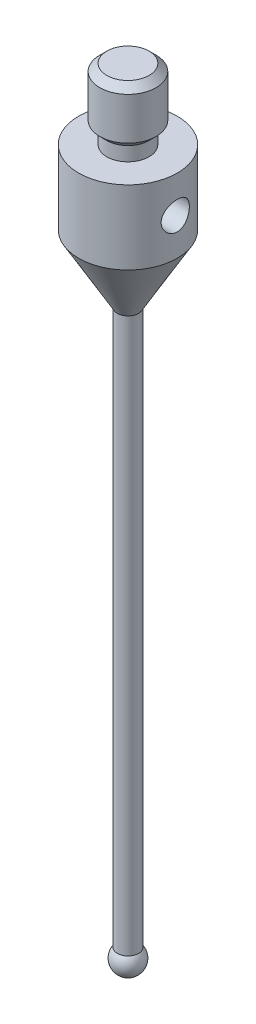
ISO-10303-21;
HEADER;
FILE_DESCRIPTION(('STEP AP214'),'2;1');
FILE_NAME('part.step','',(''),(''),'','','');
FILE_SCHEMA(('AUTOMOTIVE_DESIGN { 1 0 10303 214 1 1 1 1 }'));
ENDSEC;
DATA;
#1=APPLICATION_CONTEXT('core data for automotive mechanical design processes');
#2=APPLICATION_PROTOCOL_DEFINITION('international standard','automotive_design',2000,#1);
#3=PRODUCT_CONTEXT('',#1,'mechanical');
#4=PRODUCT('Part','Part','',(#3));
#5=PRODUCT_RELATED_PRODUCT_CATEGORY('part','',(#4));
#6=PRODUCT_DEFINITION_FORMATION('','',#4);
#7=PRODUCT_DEFINITION_CONTEXT('part definition',#1,'design');
#8=PRODUCT_DEFINITION('design','',#6,#7);
#9=PRODUCT_DEFINITION_SHAPE('','',#8);
#10=(LENGTH_UNIT() NAMED_UNIT(*) SI_UNIT(.MILLI.,.METRE.));
#11=(NAMED_UNIT(*) PLANE_ANGLE_UNIT() SI_UNIT($,.RADIAN.));
#12=(NAMED_UNIT(*) SI_UNIT($,.STERADIAN.) SOLID_ANGLE_UNIT());
#13=UNCERTAINTY_MEASURE_WITH_UNIT(LENGTH_MEASURE(1.E-05),#10,'distance_accuracy_value','');
#14=(GEOMETRIC_REPRESENTATION_CONTEXT(3) GLOBAL_UNCERTAINTY_ASSIGNED_CONTEXT((#13)) GLOBAL_UNIT_ASSIGNED_CONTEXT((#10,
#11,#12)) REPRESENTATION_CONTEXT('',''));
#15=CARTESIAN_POINT('',(0.,0.,0.));
#16=DIRECTION('',(0.,0.,1.));
#17=DIRECTION('',(1.,0.,0.));
#18=AXIS2_PLACEMENT_3D('',#15,#16,#17);
#19=CARTESIAN_POINT('',(0.,40.,0.));
#20=DIRECTION('',(0.,-1.,0.));
#21=DIRECTION('',(0.,0.,-1.));
#22=AXIS2_PLACEMENT_3D('',#19,#20,#21);
#23=CYLINDRICAL_SURFACE('',#22,0.75);
#24=CARTESIAN_POINT('',(0.,0.661437827766147,0.));
#25=DIRECTION('',(0.,-1.,0.));
#26=DIRECTION('',(0.,0.,-1.));
#27=AXIS2_PLACEMENT_3D('',#24,#25,#26);
#28=CIRCLE('',#27,0.75);
#29=CARTESIAN_POINT('',(0.,0.661437827766147,-0.75));
#30=VERTEX_POINT('',#29);
#31=EDGE_CURVE('E158',#30,#30,#28,.T.);
#32=ORIENTED_EDGE('',*,*,#31,.F.);
#33=EDGE_LOOP('',(#32));
#34=FACE_BOUND('',#33,.T.);
#35=CARTESIAN_POINT('',(0.,40.,0.));
#36=DIRECTION('',(0.,1.,0.));
#37=DIRECTION('',(0.,0.,1.));
#38=AXIS2_PLACEMENT_3D('',#35,#36,#37);
#39=CIRCLE('',#38,0.75);
#40=CARTESIAN_POINT('',(0.,40.,0.750000000000002));
#41=VERTEX_POINT('',#40);
#42=EDGE_CURVE('E154',#41,#41,#39,.T.);
#43=ORIENTED_EDGE('',*,*,#42,.F.);
#44=EDGE_LOOP('',(#43));
#45=FACE_BOUND('',#44,.T.);
#46=ADVANCED_FACE('F41',(#34,#45),#23,.T.);
#47=CARTESIAN_POINT('',(0.,0.,0.));
#48=DIRECTION('',(0.,-1.,0.));
#49=DIRECTION('',(-1.,0.,0.));
#50=AXIS2_PLACEMENT_3D('',#47,#48,#49);
#51=SPHERICAL_SURFACE('',#50,1.);
#52=ORIENTED_EDGE('',*,*,#31,.T.);
#53=EDGE_LOOP('',(#52));
#54=FACE_BOUND('',#53,.T.);
#55=ADVANCED_FACE('F99',(#54),#51,.T.);
#56=CARTESIAN_POINT('',(0.,50.,0.));
#57=DIRECTION('',(0.,-1.,0.));
#58=DIRECTION('',(0.,0.,-1.));
#59=AXIS2_PLACEMENT_3D('',#56,#57,#58);
#60=CYLINDRICAL_SURFACE('',#59,3.5);
#61=CARTESIAN_POINT('',(-3.5,46.3815698604072,0.));
#62=CARTESIAN_POINT('',(-3.49999934647171,46.3815708301882,-0.0549774511886254));
#63=CARTESIAN_POINT('',(-3.49869208701023,46.3861187548953,-0.10996487393629));
#64=CARTESIAN_POINT('',(-3.49360452972549,46.4041519954584,-0.218345995598493));
#65=CARTESIAN_POINT('',(-3.48982329605034,46.4176406934442,-0.271739083414807));
#66=CARTESIAN_POINT('',(-3.48020345674544,46.4530738796155,-0.375352150368938));
#67=CARTESIAN_POINT('',(-3.474367720532,46.4750065784832,-0.425576440424118));
#68=CARTESIAN_POINT('',(-3.46124989158242,46.5266588561464,-0.521634380564639));
#69=CARTESIAN_POINT('',(-3.45396764753901,46.5563792496523,-0.567467570589079));
#70=CARTESIAN_POINT('',(-3.43852367312902,46.6235873657437,-0.654647223429478));
#71=CARTESIAN_POINT('',(-3.4303452097302,46.661242237335,-0.69586186119049));
#72=CARTESIAN_POINT('',(-3.41413367457396,46.7428937319759,-0.771485678962155));
#73=CARTESIAN_POINT('',(-3.40610062478084,46.7868913042228,-0.805893838538838));
#74=CARTESIAN_POINT('',(-3.39091507439313,46.8810666518032,-0.867598950032228));
#75=CARTESIAN_POINT('',(-3.38378351259108,46.9313508529417,-0.894739105517028));
#76=CARTESIAN_POINT('',(-3.37145671914235,47.0360058662805,-0.940125852769615));
#77=CARTESIAN_POINT('',(-3.36626107099664,47.0903757964348,-0.958374357777523));
#78=CARTESIAN_POINT('',(-3.35856804120241,47.2001872419913,-0.984992165068876));
#79=CARTESIAN_POINT('',(-3.35600489366891,47.2555655418063,-0.993602766016076));
#80=CARTESIAN_POINT('',(-3.35367104182518,47.3670354346488,-1.00145333894795));
#81=CARTESIAN_POINT('',(-3.35389973075333,47.4231268700404,-1.00069534704803));
#82=CARTESIAN_POINT('',(-3.35706517184156,47.532504166134,-0.990020673813953));
#83=CARTESIAN_POINT('',(-3.35991391343389,47.5858220359972,-0.980401628641804));
#84=CARTESIAN_POINT('',(-3.36785674196985,47.6900534702213,-0.952756930429097));
#85=CARTESIAN_POINT('',(-3.37295103189705,47.7409668167675,-0.93473051740629));
#86=CARTESIAN_POINT('',(-3.38488431756517,47.839692982623,-0.89055340568902));
#87=CARTESIAN_POINT('',(-3.39174458202416,47.887458396608,-0.864302755864396));
#88=CARTESIAN_POINT('',(-3.40642608441438,47.9780081410139,-0.804491895839433));
#89=CARTESIAN_POINT('',(-3.41424753611067,48.0207913592747,-0.770930058366726));
#90=CARTESIAN_POINT('',(-3.43033125328062,48.1018560482104,-0.695951998365101));
#91=CARTESIAN_POINT('',(-3.43859902286152,48.1399070983908,-0.654287437422663));
#92=CARTESIAN_POINT('',(-3.45438123609203,48.2085328622273,-0.565066141193115));
#93=CARTESIAN_POINT('',(-3.46189564068921,48.2391071884281,-0.517509100740949));
#94=CARTESIAN_POINT('',(-3.47538264032742,48.2920342277942,-0.417461536545725));
#95=CARTESIAN_POINT('',(-3.48134637748612,48.3143400038093,-0.364944908905004));
#96=CARTESIAN_POINT('',(-3.49099625743795,48.3497368061156,-0.256696614983736));
#97=CARTESIAN_POINT('',(-3.49468297428128,48.3628301550298,-0.200965762905076));
#98=CARTESIAN_POINT('',(-3.49927437257336,48.3790565032619,-0.0898331943221778));
#99=CARTESIAN_POINT('',(-3.50026636425301,48.3825022080937,-0.034480673430256));
#100=CARTESIAN_POINT('',(-3.49961042353544,48.3802062272567,0.0760132634027897));
#101=CARTESIAN_POINT('',(-3.49796280790308,48.3744656439842,0.131154703878552));
#102=CARTESIAN_POINT('',(-3.49226963342609,48.3542146382491,0.238509316715158));
#103=CARTESIAN_POINT('',(-3.48827306508862,48.3398832697455,0.290759105867426));
#104=CARTESIAN_POINT('',(-3.4783399937092,48.3030696094149,0.392104343102813));
#105=CARTESIAN_POINT('',(-3.47240326632854,48.2805863749626,0.441199425624336));
#106=CARTESIAN_POINT('',(-3.45904980584657,48.2275581920846,0.536020842560035));
#107=CARTESIAN_POINT('',(-3.45160381589488,48.1968492609943,0.581651243270122));
#108=CARTESIAN_POINT('',(-3.43608973548903,48.1284436074319,0.66721926402965));
#109=CARTESIAN_POINT('',(-3.42802150376367,48.0907452953758,0.707155585421211));
#110=CARTESIAN_POINT('',(-3.41184309815947,48.0079651893816,0.78155321417035));
#111=CARTESIAN_POINT('',(-3.40374018433795,47.9626822226244,0.815792713704765));
#112=CARTESIAN_POINT('',(-3.38869447362751,47.8668385660982,0.876197658032577));
#113=CARTESIAN_POINT('',(-3.3817516363796,47.816278060034,0.902363383738853));
#114=CARTESIAN_POINT('',(-3.36989325638715,47.7115242549113,0.945687270594171));
#115=CARTESIAN_POINT('',(-3.36496700079018,47.6573519786209,0.962893166212216));
#116=CARTESIAN_POINT('',(-3.35771228398834,47.54671489258,0.987897250353705));
#117=CARTESIAN_POINT('',(-3.35538303564047,47.4902507828562,0.995698289511612));
#118=CARTESIAN_POINT('',(-3.35365851547575,47.3789218439464,1.00149012123096));
#119=CARTESIAN_POINT('',(-3.35415580399703,47.3240771081309,0.999840138221142));
#120=CARTESIAN_POINT('',(-3.35777298607399,47.2154824950743,0.987623554788215));
#121=CARTESIAN_POINT('',(-3.36089279211716,47.1617325813607,0.977057251899602));
#122=CARTESIAN_POINT('',(-3.36933488579116,47.0573806748234,0.947529844083144));
#123=CARTESIAN_POINT('',(-3.37463438524179,47.0067521669018,0.928655458931766));
#124=CARTESIAN_POINT('',(-3.38683651421364,46.909340493161,0.883114746507971));
#125=CARTESIAN_POINT('',(-3.3937394274128,46.8625580097706,0.856447040215779));
#126=CARTESIAN_POINT('',(-3.40865834474881,46.7724780995046,0.795032732674124));
#127=CARTESIAN_POINT('',(-3.41670381589509,46.7293491647362,0.760046138613655));
#128=CARTESIAN_POINT('',(-3.43284922546139,46.6494579125023,0.683429920189677));
#129=CARTESIAN_POINT('',(-3.4409491770859,46.6126972008518,0.641798625364279));
#130=CARTESIAN_POINT('',(-3.45653979786176,46.5456512682439,0.551787160432693));
#131=CARTESIAN_POINT('',(-3.46400950518705,46.5155563667724,0.503261251179888));
#132=CARTESIAN_POINT('',(-3.47725697888987,46.4639969678962,0.401625264823329));
#133=CARTESIAN_POINT('',(-3.48303566935144,46.4425277544407,0.348517712057369));
#134=CARTESIAN_POINT('',(-3.49163672362653,46.4111460847095,0.246458157667517));
#135=CARTESIAN_POINT('',(-3.49474842181038,46.4000830920649,0.197881503812195));
#136=CARTESIAN_POINT('',(-3.49893021926074,46.3852950317861,0.0995391843931839));
#137=CARTESIAN_POINT('',(-3.50000059166997,46.3815689824188,0.0497736788080459));
#138=CARTESIAN_POINT('',(-3.5,46.3815698604072,0.));
#139=B_SPLINE_CURVE_WITH_KNOTS('',3,(#61,#62,#63,#64,#65,#66,#67,#68,#69,#70,#71,#72,#73,#74,
#75,#76,#77,#78,#79,#80,#81,#82,#83,#84,#85,#86,#87,#88,#89,#90,#91,#92,#93,#94,#95,#96,#97,#98,
#99,#100,#101,#102,#103,#104,#105,#106,#107,#108,#109,#110,#111,#112,#113,#114,#115,#116,#117,
#118,#119,#120,#121,#122,#123,#124,#125,#126,#127,#128,#129,#130,#131,#132,#133,#134,#135,#136,
#137,#138),.UNSPECIFIED.,.T.,.F.,(4,2,2,2,2,2,2,2,2,2,2,2,2,2,2,2,2,2,2,2,2,2,2,2,2,2,2,2,2,2,2,
2,2,2,2,2,2,2,4),(0.,0.164749656271172,0.329561669897589,0.494144406447679,0.658744367717579,
0.827239057653909,0.995758989368571,1.16766537650028,1.33953475772405,1.50699754929409,
1.67442394611628,1.83642392910678,1.99843855889074,2.16250401641616,2.32660602784683,
2.49689250297262,2.66718780073735,2.83843550548235,3.00964002003317,3.17522728845111,
3.34079468713335,3.50302570235771,3.66527548283776,3.83103762668236,3.99683751589904,
4.16806052438177,4.3392775747866,4.50957286677748,4.6798165288708,4.84363340801449,
5.00744482086202,5.16958548138845,5.33175484992002,5.49933828438395,5.6669639154745,
5.83888989478295,6.01072174610257,6.15989734012186,6.30905297207072),.UNSPECIFIED.);
#140=CARTESIAN_POINT('',(-3.5,46.3815698604072,0.));
#141=VERTEX_POINT('',#140);
#142=EDGE_CURVE('E63',#141,#141,#139,.T.);
#143=ORIENTED_EDGE('',*,*,#142,.T.);
#144=EDGE_LOOP('',(#143));
#145=FACE_BOUND('',#144,.T.);
#146=CARTESIAN_POINT('',(3.35410196624968,47.3815698604072,-1.));
#147=CARTESIAN_POINT('',(3.3541027352982,47.3266440914845,-0.999999010234619));
#148=CARTESIAN_POINT('',(3.35546589937234,47.2717083183274,-0.995459333009394));
#149=CARTESIAN_POINT('',(3.36075194701915,47.1634342410196,-0.977461816962149));
#150=CARTESIAN_POINT('',(3.36467587174621,47.1100965958656,-0.9640003506833));
#151=CARTESIAN_POINT('',(3.37460354734501,47.006601259956,-0.92864671646041));
#152=CARTESIAN_POINT('',(3.38060407621639,46.9564387844945,-0.90676760325832));
#153=CARTESIAN_POINT('',(3.39400460555119,46.8604859546342,-0.855241820315741));
#154=CARTESIAN_POINT('',(3.40140477214508,46.8146961202193,-0.825594228332018));
#155=CARTESIAN_POINT('',(3.41700891605117,46.7274740777486,-0.758462400490702));
#156=CARTESIAN_POINT('',(3.42522877981549,46.6861859593423,-0.720794605566172));
#157=CARTESIAN_POINT('',(3.44140982756535,46.6104184687556,-0.639085622734718));
#158=CARTESIAN_POINT('',(3.44937098116968,46.5759398938459,-0.595043689579841));
#159=CARTESIAN_POINT('',(3.46431666000611,46.5141555362304,-0.500823016078777));
#160=CARTESIAN_POINT('',(3.47128027250394,46.4869950505317,-0.450545391880932));
#161=CARTESIAN_POINT('',(3.48326270242804,46.4415689731992,-0.345904237619829));
#162=CARTESIAN_POINT('',(3.48828189845443,46.4233016497871,-0.291541505437589));
#163=CARTESIAN_POINT('',(3.49569759650108,46.3966526297873,-0.181779287560588));
#164=CARTESIAN_POINT('',(3.49815913505649,46.3880253495549,-0.12644389906452));
#165=CARTESIAN_POINT('',(3.50041047829849,46.3801264934656,-0.0150600512109622));
#166=CARTESIAN_POINT('',(3.50020079369491,46.3808531292385,0.0409882697942743));
#167=CARTESIAN_POINT('',(3.49718003381653,46.3914730478662,0.150490097867611));
#168=CARTESIAN_POINT('',(3.49444435388027,46.4011006667262,0.203971773054474));
#169=CARTESIAN_POINT('',(3.48676943165067,46.4288174116394,0.308526111088809));
#170=CARTESIAN_POINT('',(3.48183005528105,46.4469070525383,0.359598627150254));
#171=CARTESIAN_POINT('',(3.47019515886062,46.4912245608131,0.458536916864462));
#172=CARTESIAN_POINT('',(3.46348102756093,46.5175392493114,0.506361521925388));
#173=CARTESIAN_POINT('',(3.44901384486994,46.5774921536062,0.597003621795243));
#174=CARTESIAN_POINT('',(3.44126056595877,46.6111319742404,0.639820016208003));
#175=CARTESIAN_POINT('',(3.42522841509913,46.6861727157165,0.720816324273876));
#176=CARTESIAN_POINT('',(3.41694064685079,46.7278045772098,0.758780788792453));
#177=CARTESIAN_POINT('',(3.4010148689311,46.8169274063302,0.827246507874878));
#178=CARTESIAN_POINT('',(3.39337691201241,46.8644188488816,0.857747156891288));
#179=CARTESIAN_POINT('',(3.37957587408658,46.9644353026563,0.910616679927257));
#180=CARTESIAN_POINT('',(3.37342505474766,47.0169974729335,0.932918688943928));
#181=CARTESIAN_POINT('',(3.36344272188227,47.1253464421591,0.968294757480383));
#182=CARTESIAN_POINT('',(3.35961053356452,47.1811322977355,0.981371502013292));
#183=CARTESIAN_POINT('',(3.35484557617748,47.2923100725691,0.997537085998827));
#184=CARTESIAN_POINT('',(3.35381855730447,47.3476507688676,1.00095074078696));
#185=CARTESIAN_POINT('',(3.35452079870229,47.4581140183647,0.998594983598455));
#186=CARTESIAN_POINT('',(3.35624971515342,47.5132365979145,0.992826717122485));
#187=CARTESIAN_POINT('',(3.36217715008271,47.6203904744225,0.972558907129289));
#188=CARTESIAN_POINT('',(3.3663182147774,47.6724636534158,0.958262310920608));
#189=CARTESIAN_POINT('',(3.37654531970352,47.7734707964051,0.921575809332241));
#190=CARTESIAN_POINT('',(3.38263164056921,47.8224043062297,0.899184736133866));
#191=CARTESIAN_POINT('',(3.3962509400331,47.9170808980159,0.846309825608091));
#192=CARTESIAN_POINT('',(3.40381598690189,47.9627150825084,0.815639458645651));
#193=CARTESIAN_POINT('',(3.41946863275287,48.0483080471288,0.747302318424216));
#194=CARTESIAN_POINT('',(3.42755634473907,48.0882655939132,0.709634028840687));
#195=CARTESIAN_POINT('',(3.44367363717939,48.1627595695513,0.626854004982777));
#196=CARTESIAN_POINT('',(3.45169203023043,48.1970673461166,0.581533855120274));
#197=CARTESIAN_POINT('',(3.46648988523027,48.2575927010986,0.485592653528773));
#198=CARTESIAN_POINT('',(3.47326941192714,48.2838107023684,0.434971879049091));
#199=CARTESIAN_POINT('',(3.48478252423195,48.3271620039204,0.33021663647808));
#200=CARTESIAN_POINT('',(3.48953154063622,48.3443640552003,0.276112399949815));
#201=CARTESIAN_POINT('',(3.49651669811944,48.3693832613773,0.165622824274959));
#202=CARTESIAN_POINT('',(3.4987534856151,48.3772028304979,0.109238075792717));
#203=CARTESIAN_POINT('',(3.50042667501642,48.3830655774061,-0.00208911897951581));
#204=CARTESIAN_POINT('',(3.49995851794498,48.3814419349486,-0.0570128155249793));
#205=CARTESIAN_POINT('',(3.49649534561067,48.3692507197021,-0.165772586211003));
#206=CARTESIAN_POINT('',(3.49350045135296,48.3586835752162,-0.219608712308766));
#207=CARTESIAN_POINT('',(3.48534400930059,48.3291041799178,-0.324202066519794));
#208=CARTESIAN_POINT('',(3.4802020702409,48.3101682709352,-0.374982516717526));
#209=CARTESIAN_POINT('',(3.46828547071724,48.2644567812645,-0.472673601380731));
#210=CARTESIAN_POINT('',(3.46151055750883,48.2376799868611,-0.519583635290339));
#211=CARTESIAN_POINT('',(3.44679477720104,48.1761211916948,-0.609716728176955));
#212=CARTESIAN_POINT('',(3.43882522893152,48.141124817013,-0.652788664003537));
#213=CARTESIAN_POINT('',(3.42272032493228,48.0645152976802,-0.732560611159188));
#214=CARTESIAN_POINT('',(3.4145849239342,48.0229003248647,-0.769258856094888));
#215=CARTESIAN_POINT('',(3.39882018772077,47.9329214019095,-0.836204230145644));
#216=CARTESIAN_POINT('',(3.39120975884781,47.8844088866556,-0.866256583618024));
#217=CARTESIAN_POINT('',(3.37764222665283,47.7828089277497,-0.917739718098038));
#218=CARTESIAN_POINT('',(3.37168419857914,47.7297240648624,-0.939175324424089));
#219=CARTESIAN_POINT('',(3.36279229780033,47.6277430102914,-0.970492670062521));
#220=CARTESIAN_POINT('',(3.3595621942308,47.579224686358,-0.981529499909265));
#221=CARTESIAN_POINT('',(3.35521684727178,47.4809968012292,-0.99628303521783));
#222=CARTESIAN_POINT('',(3.35410127012429,47.4312874292842,-1.00000089591333));
#223=CARTESIAN_POINT('',(3.35410196624968,47.3815698604072,-1.));
#224=B_SPLINE_CURVE_WITH_KNOTS('',3,(#146,#147,#148,#149,#150,#151,#152,#153,#154,#155,#156,
#157,#158,#159,#160,#161,#162,#163,#164,#165,#166,#167,#168,#169,#170,#171,#172,#173,#174,#175,
#176,#177,#178,#179,#180,#181,#182,#183,#184,#185,#186,#187,#188,#189,#190,#191,#192,#193,#194,
#195,#196,#197,#198,#199,#200,#201,#202,#203,#204,#205,#206,#207,#208,#209,#210,#211,#212,#213,
#214,#215,#216,#217,#218,#219,#220,#221,#222,#223),.UNSPECIFIED.,.T.,.F.,(4,2,2,2,2,2,2,2,2,2,2,
2,2,2,2,2,2,2,2,2,2,2,2,2,2,2,2,2,2,2,2,2,2,2,2,2,2,2,4),(0.,0.164594171159105,0.32925530476515,
0.493662091823938,0.658088405459392,0.826785835988794,0.995503006148128,1.16735741502495,
1.33917834504425,1.50651450509943,1.67381867271781,1.83628518817283,1.99876158968833,
2.16301451684818,2.32730346587989,2.49735806342072,2.66742645310452,2.83885260310575,
3.01022883892078,3.17577181660545,3.34129414341278,3.50302644820309,3.66478209600075,
3.83054003013244,3.99633392302106,4.16772694180382,4.33911100034378,4.50916842641099,
4.67918208530373,4.84323448834084,5.00727903537341,5.16985706186659,5.33246026763665,
5.4998988436474,5.6673837494971,5.83926806202707,6.01105598599879,6.160066444253,
6.30905338065555),.UNSPECIFIED.);
#225=CARTESIAN_POINT('',(3.35410196624968,47.3815698604072,-1.));
#226=VERTEX_POINT('',#225);
#227=EDGE_CURVE('E72',#226,#226,#224,.T.);
#228=ORIENTED_EDGE('',*,*,#227,.T.);
#229=EDGE_LOOP('',(#228));
#230=FACE_BOUND('',#229,.T.);
#231=CARTESIAN_POINT('',(0.,44.7631397208144,0.));
#232=DIRECTION('',(0.,1.,0.));
#233=DIRECTION('',(0.,0.,1.));
#234=AXIS2_PLACEMENT_3D('',#231,#232,#233);
#235=CIRCLE('',#234,3.5);
#236=CARTESIAN_POINT('',(0.,44.7631397208144,3.5));
#237=VERTEX_POINT('',#236);
#238=EDGE_CURVE('E161',#237,#237,#235,.T.);
#239=ORIENTED_EDGE('',*,*,#238,.T.);
#240=EDGE_LOOP('',(#239));
#241=FACE_BOUND('',#240,.T.);
#242=CARTESIAN_POINT('',(0.,50.,0.));
#243=DIRECTION('',(0.,1.,0.));
#244=DIRECTION('',(0.,0.,1.));
#245=AXIS2_PLACEMENT_3D('',#242,#243,#244);
#246=CIRCLE('',#245,3.5);
#247=CARTESIAN_POINT('',(0.,50.,3.5));
#248=VERTEX_POINT('',#247);
#249=EDGE_CURVE('E150',#248,#248,#246,.T.);
#250=ORIENTED_EDGE('',*,*,#249,.F.);
#251=EDGE_LOOP('',(#250));
#252=FACE_BOUND('',#251,.T.);
#253=ADVANCED_FACE('F77',(#145,#230,#241,#252),#60,.T.);
#254=CARTESIAN_POINT('',(0.,50.,0.));
#255=DIRECTION('',(0.,1.,0.));
#256=DIRECTION('',(0.,0.,1.));
#257=AXIS2_PLACEMENT_3D('',#254,#255,#256);
#258=PLANE('',#257);
#259=CARTESIAN_POINT('',(0.,50.,0.));
#260=DIRECTION('',(0.,1.,0.));
#261=DIRECTION('',(0.,0.,1.));
#262=AXIS2_PLACEMENT_3D('',#259,#260,#261);
#263=CIRCLE('',#262,1.5);
#264=CARTESIAN_POINT('',(0.,50.,1.5));
#265=VERTEX_POINT('',#264);
#266=EDGE_CURVE('E60',#265,#265,#263,.T.);
#267=ORIENTED_EDGE('',*,*,#266,.F.);
#268=EDGE_LOOP('',(#267));
#269=FACE_BOUND('',#268,.T.);
#270=ORIENTED_EDGE('',*,*,#249,.T.);
#271=EDGE_LOOP('',(#270));
#272=FACE_BOUND('',#271,.T.);
#273=ADVANCED_FACE('F89',(#269,#272),#258,.T.);
#274=CARTESIAN_POINT('',(0.,44.7631397208144,0.));
#275=DIRECTION('',(0.,1.,0.));
#276=DIRECTION('',(0.,0.,1.));
#277=AXIS2_PLACEMENT_3D('',#274,#275,#276);
#278=CONICAL_SURFACE('',#277,3.5,0.523598775598299);
#279=CARTESIAN_POINT('',(0.,40.,0.750000000000002));
#280=CARTESIAN_POINT('',(0.,40.0496160387585,0.778645833333334));
#281=CARTESIAN_POINT('',(0.,40.099232077517,0.807291666666668));
#282=CARTESIAN_POINT('',(0.,40.1984641550339,0.864583333333335));
#283=CARTESIAN_POINT('',(0.,40.2480801937924,0.893229166666669));
#284=CARTESIAN_POINT('',(0.,40.3473122713094,0.950520833333336));
#285=CARTESIAN_POINT('',(0.,40.3969283100679,0.979166666666669));
#286=CARTESIAN_POINT('',(0.,40.4961603875848,1.03645833333333));
#287=CARTESIAN_POINT('',(0.,40.5457764263433,1.06510416666667));
#288=CARTESIAN_POINT('',(0.,40.6450085038603,1.12239583333333));
#289=CARTESIAN_POINT('',(0.,40.6946245426188,1.15104166666667));
#290=CARTESIAN_POINT('',(0.,40.7938566201357,1.20833333333334));
#291=CARTESIAN_POINT('',(0.,40.8434726588942,1.23697916666667));
#292=CARTESIAN_POINT('',(0.,40.9427047364112,1.29427083333333));
#293=CARTESIAN_POINT('',(0.,40.9923207751697,1.32291666666667));
#294=CARTESIAN_POINT('',(0.,41.0915528526866,1.38020833333333));
#295=CARTESIAN_POINT('',(0.,41.1411688914451,1.40885416666667));
#296=CARTESIAN_POINT('',(0.,41.2404009689621,1.46614583333333));
#297=CARTESIAN_POINT('',(0.,41.2900170077206,1.49479166666667));
#298=CARTESIAN_POINT('',(0.,41.3892490852375,1.55208333333333));
#299=CARTESIAN_POINT('',(0.,41.438865123996,1.58072916666667));
#300=CARTESIAN_POINT('',(0.,41.538097201513,1.63802083333333));
#301=CARTESIAN_POINT('',(0.,41.5877132402715,1.66666666666667));
#302=CARTESIAN_POINT('',(0.,41.6869453177884,1.72395833333333));
#303=CARTESIAN_POINT('',(0.,41.7365613565469,1.75260416666667));
#304=CARTESIAN_POINT('',(0.,41.8357934340639,1.80989583333333));
#305=CARTESIAN_POINT('',(0.,41.8854094728224,1.83854166666667));
#306=CARTESIAN_POINT('',(0.,41.9846415503393,1.89583333333333));
#307=CARTESIAN_POINT('',(0.,42.0342575890978,1.92447916666667));
#308=CARTESIAN_POINT('',(0.,42.1334896666148,1.98177083333333));
#309=CARTESIAN_POINT('',(0.,42.1831057053733,2.01041666666667));
#310=CARTESIAN_POINT('',(0.,42.2823377828902,2.06770833333333));
#311=CARTESIAN_POINT('',(0.,42.3319538216487,2.09635416666667));
#312=CARTESIAN_POINT('',(0.,42.4311858991657,2.15364583333333));
#313=CARTESIAN_POINT('',(0.,42.4808019379242,2.18229166666667));
#314=CARTESIAN_POINT('',(0.,42.5800340154411,2.23958333333333));
#315=CARTESIAN_POINT('',(0.,42.6296500541996,2.26822916666667));
#316=CARTESIAN_POINT('',(0.,42.7288821317166,2.32552083333333));
#317=CARTESIAN_POINT('',(0.,42.7784981704751,2.35416666666667));
#318=CARTESIAN_POINT('',(0.,42.877730247992,2.41145833333333));
#319=CARTESIAN_POINT('',(0.,42.9273462867505,2.44010416666667));
#320=CARTESIAN_POINT('',(0.,43.0265783642675,2.49739583333333));
#321=CARTESIAN_POINT('',(0.,43.076194403026,2.52604166666667));
#322=CARTESIAN_POINT('',(0.,43.1754264805429,2.58333333333333));
#323=CARTESIAN_POINT('',(0.,43.2250425193014,2.61197916666667));
#324=CARTESIAN_POINT('',(0.,43.3242745968184,2.66927083333333));
#325=CARTESIAN_POINT('',(0.,43.3738906355769,2.69791666666667));
#326=CARTESIAN_POINT('',(0.,43.4731227130938,2.75520833333333));
#327=CARTESIAN_POINT('',(0.,43.5227387518523,2.78385416666666));
#328=CARTESIAN_POINT('',(0.,43.6219708293693,2.84114583333333));
#329=CARTESIAN_POINT('',(0.,43.6715868681278,2.86979166666667));
#330=CARTESIAN_POINT('',(0.,43.7708189456447,2.92708333333333));
#331=CARTESIAN_POINT('',(0.,43.8204349844032,2.95572916666667));
#332=CARTESIAN_POINT('',(0.,43.9196670619202,3.01302083333333));
#333=CARTESIAN_POINT('',(0.,43.9692831006787,3.04166666666666));
#334=CARTESIAN_POINT('',(0.,44.0685151781956,3.09895833333333));
#335=CARTESIAN_POINT('',(0.,44.1181312169541,3.12760416666667));
#336=CARTESIAN_POINT('',(0.,44.2173632944711,3.18489583333333));
#337=CARTESIAN_POINT('',(0.,44.2669793332296,3.21354166666666));
#338=CARTESIAN_POINT('',(0.,44.3662114107465,3.27083333333333));
#339=CARTESIAN_POINT('',(0.,44.415827449505,3.29947916666666));
#340=CARTESIAN_POINT('',(0.,44.515059527022,3.35677083333333));
#341=CARTESIAN_POINT('',(0.,44.5646755657805,3.38541666666667));
#342=CARTESIAN_POINT('',(0.,44.6639076432974,3.44270833333333));
#343=CARTESIAN_POINT('',(0.,44.7135236820559,3.47135416666667));
#344=CARTESIAN_POINT('',(0.,44.7631397208144,3.5));
#345=B_SPLINE_CURVE_WITH_KNOTS('',3,(#279,#280,#281,#282,#283,#284,#285,#286,#287,#288,#289,
#290,#291,#292,#293,#294,#295,#296,#297,#298,#299,#300,#301,#302,#303,#304,#305,#306,#307,#308,
#309,#310,#311,#312,#313,#314,#315,#316,#317,#318,#319,#320,#321,#322,#323,#324,#325,#326,#327,
#328,#329,#330,#331,#332,#333,#334,#335,#336,#337,#338,#339,#340,#341,#342,#343,#344),
.UNSPECIFIED.,.F.,.F.,(4,2,2,2,2,2,2,2,2,2,2,2,2,2,2,2,2,2,2,2,2,2,2,2,2,2,2,2,2,2,2,2,4),(0.,
0.171875000000004,0.343750000000001,0.515624999999999,0.687500000000002,0.859375,1.03125,
1.203125,1.375,1.546875,1.71875,1.890625,2.0625,2.234375,2.40625,2.578125,2.75,2.92187499999999,
3.09375,3.265625,3.43749999999999,3.609375,3.78124999999999,3.95312499999999,4.125,
4.29687499999999,4.46874999999999,4.64062499999999,4.81249999999999,4.984375,5.15624999999999,
5.32812499999999,5.49999999999999),.UNSPECIFIED.);
#346=EDGE_CURVE('BSEAM86',#41,#237,#345,.T.);
#347=ORIENTED_EDGE('',*,*,#42,.T.);
#348=ORIENTED_EDGE('',*,*,#238,.F.);
#349=ORIENTED_EDGE('',*,*,#346,.T.);
#350=ORIENTED_EDGE('',*,*,#346,.F.);
#351=EDGE_LOOP('',(#347,#349,#348,#350));
#352=FACE_BOUND('',#351,.T.);
#353=ADVANCED_FACE('F86',(#352),#278,.T.);
#354=CARTESIAN_POINT('',(-3.5,47.3815698604072,0.));
#355=DIRECTION('',(1.,0.,0.));
#356=DIRECTION('',(0.,0.,-1.));
#357=AXIS2_PLACEMENT_3D('',#354,#355,#356);
#358=CYLINDRICAL_SURFACE('',#357,1.);
#359=ORIENTED_EDGE('',*,*,#227,.F.);
#360=EDGE_LOOP('',(#359));
#361=FACE_BOUND('',#360,.T.);
#362=ORIENTED_EDGE('',*,*,#142,.F.);
#363=EDGE_LOOP('',(#362));
#364=FACE_BOUND('',#363,.T.);
#365=ADVANCED_FACE('F81',(#361,#364),#358,.F.);
#366=CARTESIAN_POINT('',(0.,51.,0.));
#367=DIRECTION('',(0.,-1.,0.));
#368=DIRECTION('',(0.,0.,-1.));
#369=AXIS2_PLACEMENT_3D('',#366,#367,#368);
#370=CYLINDRICAL_SURFACE('',#369,1.5);
#371=CARTESIAN_POINT('',(0.,51.,0.));
#372=DIRECTION('',(0.,1.,0.));
#373=DIRECTION('',(0.,0.,1.));
#374=AXIS2_PLACEMENT_3D('',#371,#372,#373);
#375=CIRCLE('',#374,1.5);
#376=CARTESIAN_POINT('',(0.,51.,1.5));
#377=VERTEX_POINT('',#376);
#378=EDGE_CURVE('E144',#377,#377,#375,.T.);
#379=ORIENTED_EDGE('',*,*,#378,.F.);
#380=EDGE_LOOP('',(#379));
#381=FACE_BOUND('',#380,.T.);
#382=ORIENTED_EDGE('',*,*,#266,.T.);
#383=EDGE_LOOP('',(#382));
#384=FACE_BOUND('',#383,.T.);
#385=ADVANCED_FACE('F85',(#381,#384),#370,.T.);
#386=CARTESIAN_POINT('',(0.,55.,0.));
#387=DIRECTION('',(0.,-1.,0.));
#388=DIRECTION('',(0.,0.,-1.));
#389=AXIS2_PLACEMENT_3D('',#386,#387,#388);
#390=CYLINDRICAL_SURFACE('',#389,2.);
#391=CARTESIAN_POINT('',(0.,54.5,0.));
#392=DIRECTION('',(0.,1.,0.));
#393=DIRECTION('',(0.,0.,1.));
#394=AXIS2_PLACEMENT_3D('',#391,#392,#393);
#395=CIRCLE('',#394,2.);
#396=CARTESIAN_POINT('',(0.,54.5,2.));
#397=VERTEX_POINT('',#396);
#398=EDGE_CURVE('E10',#397,#397,#395,.F.);
#399=ORIENTED_EDGE('',*,*,#398,.T.);
#400=EDGE_LOOP('',(#399));
#401=FACE_BOUND('',#400,.T.);
#402=CARTESIAN_POINT('',(0.,51.5,0.));
#403=DIRECTION('',(0.,1.,0.));
#404=DIRECTION('',(0.,0.,1.));
#405=AXIS2_PLACEMENT_3D('',#402,#403,#404);
#406=CIRCLE('',#405,2.);
#407=CARTESIAN_POINT('',(0.,51.5,2.));
#408=VERTEX_POINT('',#407);
#409=EDGE_CURVE('E50',#408,#408,#406,.T.);
#410=ORIENTED_EDGE('',*,*,#409,.T.);
#411=EDGE_LOOP('',(#410));
#412=FACE_BOUND('',#411,.T.);
#413=ADVANCED_FACE('F127',(#401,#412),#390,.T.);
#414=CARTESIAN_POINT('',(0.,55.,0.));
#415=DIRECTION('',(0.,1.,0.));
#416=DIRECTION('',(0.,0.,1.));
#417=AXIS2_PLACEMENT_3D('',#414,#415,#416);
#418=PLANE('',#417);
#419=CARTESIAN_POINT('',(0.,55.,0.));
#420=DIRECTION('',(0.,1.,0.));
#421=DIRECTION('',(0.,0.,1.));
#422=AXIS2_PLACEMENT_3D('',#419,#420,#421);
#423=CIRCLE('',#422,1.50000000000001);
#424=CARTESIAN_POINT('',(0.,55.,1.50000000000001));
#425=VERTEX_POINT('',#424);
#426=EDGE_CURVE('E55',#425,#425,#423,.T.);
#427=ORIENTED_EDGE('',*,*,#426,.T.);
#428=EDGE_LOOP('',(#427));
#429=FACE_BOUND('',#428,.T.);
#430=ADVANCED_FACE('F120',(#429),#418,.T.);
#431=CARTESIAN_POINT('',(0.,55.,0.));
#432=DIRECTION('',(0.,-1.,0.));
#433=DIRECTION('',(0.,0.,-1.));
#434=AXIS2_PLACEMENT_3D('',#431,#432,#433);
#435=CONICAL_SURFACE('',#434,1.50000000000001,0.78539816339744);
#436=ORIENTED_EDGE('',*,*,#398,.F.);
#437=EDGE_LOOP('',(#436));
#438=FACE_BOUND('',#437,.T.);
#439=ORIENTED_EDGE('',*,*,#426,.F.);
#440=EDGE_LOOP('',(#439));
#441=FACE_BOUND('',#440,.T.);
#442=ADVANCED_FACE('F116',(#438,#441),#435,.T.);
#443=CARTESIAN_POINT('',(0.,51.5,0.));
#444=DIRECTION('',(0.,1.,0.));
#445=DIRECTION('',(0.,0.,1.));
#446=AXIS2_PLACEMENT_3D('',#443,#444,#445);
#447=CONICAL_SURFACE('',#446,2.,0.785398163397447);
#448=ORIENTED_EDGE('',*,*,#378,.T.);
#449=EDGE_LOOP('',(#448));
#450=FACE_BOUND('',#449,.T.);
#451=ORIENTED_EDGE('',*,*,#409,.F.);
#452=EDGE_LOOP('',(#451));
#453=FACE_BOUND('',#452,.T.);
#454=ADVANCED_FACE('F44',(#450,#453),#447,.T.);
#455=CLOSED_SHELL('',(#46,#55,#253,#273,#353,#365,#385,#413,#430,#442,#454));
#456=MANIFOLD_SOLID_BREP('B2',#455);
#457=ADVANCED_BREP_SHAPE_REPRESENTATION('',(#18,#456),#14);
#458=SHAPE_DEFINITION_REPRESENTATION(#9,#457);
ENDSEC;
END-ISO-10303-21;
